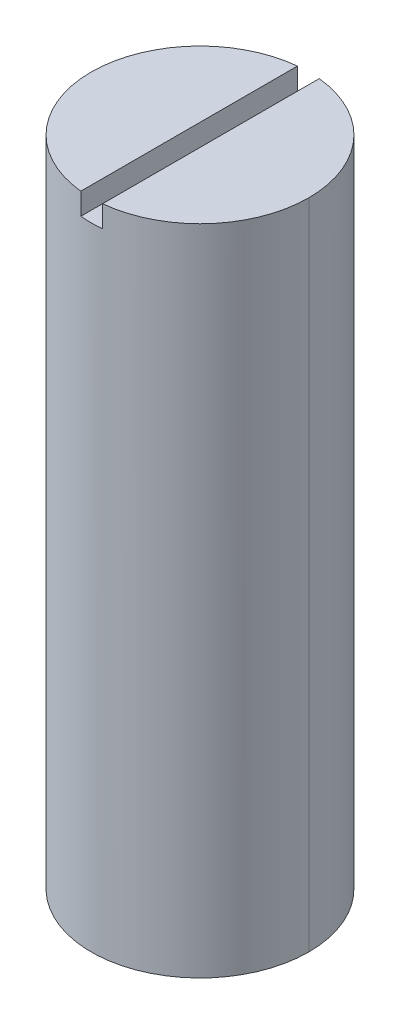
ISO-10303-21;
HEADER;
FILE_DESCRIPTION(('STEP AP214'),'2;1');
FILE_NAME('part.step','',(''),(''),'','','');
FILE_SCHEMA(('AUTOMOTIVE_DESIGN { 1 0 10303 214 1 1 1 1 }'));
ENDSEC;
DATA;
#1=APPLICATION_CONTEXT('core data for automotive mechanical design processes');
#2=APPLICATION_PROTOCOL_DEFINITION('international standard','automotive_design',2000,#1);
#3=PRODUCT_CONTEXT('',#1,'mechanical');
#4=PRODUCT('Part','Part','',(#3));
#5=PRODUCT_RELATED_PRODUCT_CATEGORY('part','',(#4));
#6=PRODUCT_DEFINITION_FORMATION('','',#4);
#7=PRODUCT_DEFINITION_CONTEXT('part definition',#1,'design');
#8=PRODUCT_DEFINITION('design','',#6,#7);
#9=PRODUCT_DEFINITION_SHAPE('','',#8);
#10=(LENGTH_UNIT() NAMED_UNIT(*) SI_UNIT(.MILLI.,.METRE.));
#11=(NAMED_UNIT(*) PLANE_ANGLE_UNIT() SI_UNIT($,.RADIAN.));
#12=(NAMED_UNIT(*) SI_UNIT($,.STERADIAN.) SOLID_ANGLE_UNIT());
#13=UNCERTAINTY_MEASURE_WITH_UNIT(LENGTH_MEASURE(1.E-05),#10,'distance_accuracy_value','');
#14=(GEOMETRIC_REPRESENTATION_CONTEXT(3) GLOBAL_UNCERTAINTY_ASSIGNED_CONTEXT((#13)) GLOBAL_UNIT_ASSIGNED_CONTEXT((#10,
#11,#12)) REPRESENTATION_CONTEXT('',''));
#15=CARTESIAN_POINT('',(0.,0.,0.));
#16=DIRECTION('',(0.,0.,1.));
#17=DIRECTION('',(1.,0.,0.));
#18=AXIS2_PLACEMENT_3D('',#15,#16,#17);
#19=CARTESIAN_POINT('',(-2.1569882664672,34.111718732022,34.1196531671633));
#20=DIRECTION('',(1.,0.,0.));
#21=DIRECTION('',(0.,1.,0.));
#22=AXIS2_PLACEMENT_3D('',#19,#20,#21);
#23=PLANE('',#22);
#24=DIRECTION('',(0.,0.,-1.));
#25=VECTOR('',#24,1.);
#26=CARTESIAN_POINT('',(-2.1569882664672,34.611718732022,36.8596605012302));
#27=LINE('',#26,#25);
#28=CARTESIAN_POINT('',(-2.1569882664672,34.611718732022,39.3471290939967));
#29=VERTEX_POINT('',#28);
#30=CARTESIAN_POINT('',(-2.1569882664672,34.611718732022,34.3721919084636));
#31=VERTEX_POINT('',#30);
#32=EDGE_CURVE('E37',#29,#31,#27,.T.);
#33=ORIENTED_EDGE('',*,*,#32,.T.);
#34=DIRECTION('',(0.,1.,0.));
#35=VECTOR('',#34,1.);
#36=CARTESIAN_POINT('',(-2.1569882664672,34.611718732022,34.3721919084636));
#37=LINE('',#36,#35);
#38=CARTESIAN_POINT('',(-2.1569882664672,34.111718732022,34.3721919084636));
#39=VERTEX_POINT('',#38);
#40=EDGE_CURVE('E147',#39,#31,#37,.T.);
#41=ORIENTED_EDGE('',*,*,#40,.F.);
#42=DIRECTION('',(0.,0.,-1.));
#43=VECTOR('',#42,1.);
#44=CARTESIAN_POINT('',(-2.1569882664672,34.111718732022,34.1196531671633));
#45=LINE('',#44,#43);
#46=CARTESIAN_POINT('',(-2.1569882664672,34.111718732022,39.3471290939967));
#47=VERTEX_POINT('',#46);
#48=EDGE_CURVE('E26',#47,#39,#45,.T.);
#49=ORIENTED_EDGE('',*,*,#48,.F.);
#50=DIRECTION('',(0.,-1.,0.));
#51=VECTOR('',#50,1.);
#52=CARTESIAN_POINT('',(-2.1569882664672,34.611718732022,39.3471290939967));
#53=LINE('',#52,#51);
#54=EDGE_CURVE('E120',#29,#47,#53,.T.);
#55=ORIENTED_EDGE('',*,*,#54,.F.);
#56=EDGE_LOOP('',(#33,#41,#49,#55));
#57=FACE_BOUND('',#56,.T.);
#58=ADVANCED_FACE('F17',(#57),#23,.F.);
#59=CARTESIAN_POINT('',(-2.6569882664672,34.111718732022,34.1196531671633));
#60=DIRECTION('',(-1.,0.,0.));
#61=DIRECTION('',(0.,1.,0.));
#62=AXIS2_PLACEMENT_3D('',#59,#60,#61);
#63=PLANE('',#62);
#64=DIRECTION('',(0.,0.,1.));
#65=VECTOR('',#64,1.);
#66=CARTESIAN_POINT('',(-2.6569882664672,34.611718732022,36.8596605012302));
#67=LINE('',#66,#65);
#68=CARTESIAN_POINT('',(-2.6569882664672,34.611718732022,34.3721919084636));
#69=VERTEX_POINT('',#68);
#70=CARTESIAN_POINT('',(-2.6569882664672,34.611718732022,39.3471290939967));
#71=VERTEX_POINT('',#70);
#72=EDGE_CURVE('E93',#69,#71,#67,.T.);
#73=ORIENTED_EDGE('',*,*,#72,.T.);
#74=DIRECTION('',(0.,1.,0.));
#75=VECTOR('',#74,1.);
#76=CARTESIAN_POINT('',(-2.6569882664672,34.611718732022,39.3471290939967));
#77=LINE('',#76,#75);
#78=CARTESIAN_POINT('',(-2.6569882664672,34.111718732022,39.3471290939967));
#79=VERTEX_POINT('',#78);
#80=EDGE_CURVE('E114',#79,#71,#77,.T.);
#81=ORIENTED_EDGE('',*,*,#80,.F.);
#82=DIRECTION('',(0.,0.,1.));
#83=VECTOR('',#82,1.);
#84=CARTESIAN_POINT('',(-2.6569882664672,34.111718732022,34.1196531671633));
#85=LINE('',#84,#83);
#86=CARTESIAN_POINT('',(-2.6569882664672,34.111718732022,34.3721919084636));
#87=VERTEX_POINT('',#86);
#88=EDGE_CURVE('E11',#87,#79,#85,.T.);
#89=ORIENTED_EDGE('',*,*,#88,.F.);
#90=DIRECTION('',(0.,-1.,0.));
#91=VECTOR('',#90,1.);
#92=CARTESIAN_POINT('',(-2.6569882664672,34.611718732022,34.3721919084636));
#93=LINE('',#92,#91);
#94=EDGE_CURVE('E97',#69,#87,#93,.T.);
#95=ORIENTED_EDGE('',*,*,#94,.F.);
#96=EDGE_LOOP('',(#73,#81,#89,#95));
#97=FACE_BOUND('',#96,.T.);
#98=ADVANCED_FACE('F19',(#97),#63,.F.);
#99=CARTESIAN_POINT('',(-2.40698826646719,34.111718732022,36.8596605012302));
#100=DIRECTION('',(0.,-1.,0.));
#101=DIRECTION('',(0.,0.,-1.));
#102=AXIS2_PLACEMENT_3D('',#99,#100,#101);
#103=PLANE('',#102);
#104=ORIENTED_EDGE('',*,*,#48,.T.);
#105=CARTESIAN_POINT('',(-2.40698826646719,34.111718732022,36.8596605012302));
#106=DIRECTION('',(0.,-1.,0.));
#107=DIRECTION('',(1.,0.,0.));
#108=AXIS2_PLACEMENT_3D('',#105,#106,#107);
#109=CIRCLE('',#108,2.5);
#110=EDGE_CURVE('E141',#87,#39,#109,.T.);
#111=ORIENTED_EDGE('',*,*,#110,.F.);
#112=ORIENTED_EDGE('',*,*,#88,.T.);
#113=CARTESIAN_POINT('',(-2.40698826646719,34.111718732022,36.8596605012302));
#114=DIRECTION('',(0.,-1.,0.));
#115=DIRECTION('',(1.,0.,0.));
#116=AXIS2_PLACEMENT_3D('',#113,#114,#115);
#117=CIRCLE('',#116,2.5);
#118=EDGE_CURVE('E122',#47,#79,#117,.T.);
#119=ORIENTED_EDGE('',*,*,#118,.F.);
#120=EDGE_LOOP('',(#104,#111,#112,#119));
#121=FACE_BOUND('',#120,.T.);
#122=ADVANCED_FACE('F228',(#121),#103,.F.);
#123=CARTESIAN_POINT('',(-2.40698826646716,19.611718732022,36.8596605012302));
#124=DIRECTION('',(0.,1.,0.));
#125=DIRECTION('',(1.,0.,0.));
#126=AXIS2_PLACEMENT_3D('',#123,#124,#125);
#127=PLANE('',#126);
#128=CARTESIAN_POINT('',(-2.40698826646716,19.611718732022,36.8596605012302));
#129=DIRECTION('',(0.,1.,0.));
#130=DIRECTION('',(-1.,0.,0.));
#131=AXIS2_PLACEMENT_3D('',#128,#129,#130);
#132=CIRCLE('',#131,2.5);
#133=CARTESIAN_POINT('',(0.093011733532833,19.611718732022,36.8596605012302));
#134=VERTEX_POINT('',#133);
#135=CARTESIAN_POINT('',(-4.90698826646717,19.611718732022,36.8596605012302));
#136=VERTEX_POINT('',#135);
#137=EDGE_CURVE('E103',#134,#136,#132,.T.);
#138=ORIENTED_EDGE('',*,*,#137,.F.);
#139=CARTESIAN_POINT('',(-2.40698826646716,19.611718732022,36.8596605012302));
#140=DIRECTION('',(0.,1.,0.));
#141=DIRECTION('',(-1.,0.,0.));
#142=AXIS2_PLACEMENT_3D('',#139,#140,#141);
#143=CIRCLE('',#142,2.5);
#144=EDGE_CURVE('E108',#136,#134,#143,.T.);
#145=ORIENTED_EDGE('',*,*,#144,.F.);
#146=EDGE_LOOP('',(#138,#145));
#147=FACE_BOUND('',#146,.T.);
#148=ADVANCED_FACE('F215',(#147),#127,.F.);
#149=CARTESIAN_POINT('',(-2.40698826646719,34.611718732022,36.8596605012302));
#150=DIRECTION('',(0.,1.,0.));
#151=DIRECTION('',(1.,0.,0.));
#152=AXIS2_PLACEMENT_3D('',#149,#150,#151);
#153=PLANE('',#152);
#154=ORIENTED_EDGE('',*,*,#32,.F.);
#155=CARTESIAN_POINT('',(-2.40698826646719,34.611718732022,36.8596605012302));
#156=DIRECTION('',(0.,1.,0.));
#157=DIRECTION('',(-1.,0.,0.));
#158=AXIS2_PLACEMENT_3D('',#155,#156,#157);
#159=CIRCLE('',#158,2.5);
#160=CARTESIAN_POINT('',(0.0930117335328048,34.611718732022,36.8596605012302));
#161=VERTEX_POINT('',#160);
#162=EDGE_CURVE('E123',#29,#161,#159,.T.);
#163=ORIENTED_EDGE('',*,*,#162,.T.);
#164=CARTESIAN_POINT('',(-2.40698826646719,34.611718732022,36.8596605012302));
#165=DIRECTION('',(0.,1.,0.));
#166=DIRECTION('',(-1.,0.,0.));
#167=AXIS2_PLACEMENT_3D('',#164,#165,#166);
#168=CIRCLE('',#167,2.5);
#169=EDGE_CURVE('E151',#161,#31,#168,.T.);
#170=ORIENTED_EDGE('',*,*,#169,.T.);
#171=EDGE_LOOP('',(#154,#163,#170));
#172=FACE_BOUND('',#171,.T.);
#173=ADVANCED_FACE('F203',(#172),#153,.T.);
#174=CARTESIAN_POINT('',(-2.40698826646719,34.611718732022,36.8596605012302));
#175=DIRECTION('',(0.,-1.,0.));
#176=DIRECTION('',(1.,0.,0.));
#177=AXIS2_PLACEMENT_3D('',#174,#175,#176);
#178=CYLINDRICAL_SURFACE('',#177,2.5);
#179=DIRECTION('',(0.,-1.,0.));
#180=VECTOR('',#179,1.);
#181=CARTESIAN_POINT('',(-4.9069882664672,34.611718732022,36.8596605012302));
#182=LINE('',#181,#180);
#183=CARTESIAN_POINT('',(-4.9069882664672,34.611718732022,36.8596605012302));
#184=VERTEX_POINT('',#183);
#185=EDGE_CURVE('E100',#184,#136,#182,.T.);
#186=ORIENTED_EDGE('',*,*,#185,.F.);
#187=CARTESIAN_POINT('',(-2.40698826646719,34.611718732022,36.8596605012302));
#188=DIRECTION('',(0.,1.,0.));
#189=DIRECTION('',(-1.,0.,0.));
#190=AXIS2_PLACEMENT_3D('',#187,#188,#189);
#191=CIRCLE('',#190,2.5);
#192=EDGE_CURVE('E88',#69,#184,#191,.T.);
#193=ORIENTED_EDGE('',*,*,#192,.F.);
#194=ORIENTED_EDGE('',*,*,#94,.T.);
#195=ORIENTED_EDGE('',*,*,#110,.T.);
#196=ORIENTED_EDGE('',*,*,#40,.T.);
#197=ORIENTED_EDGE('',*,*,#169,.F.);
#198=DIRECTION('',(0.,-1.,0.));
#199=VECTOR('',#198,1.);
#200=CARTESIAN_POINT('',(0.0930117335328048,34.611718732022,36.8596605012302));
#201=LINE('',#200,#199);
#202=EDGE_CURVE('E129',#161,#134,#201,.T.);
#203=ORIENTED_EDGE('',*,*,#202,.T.);
#204=ORIENTED_EDGE('',*,*,#137,.T.);
#205=EDGE_LOOP('',(#186,#193,#194,#195,#196,#197,#203,#204));
#206=FACE_BOUND('',#205,.T.);
#207=ADVANCED_FACE('F101',(#206),#178,.T.);
#208=CARTESIAN_POINT('',(-2.40698826646719,34.611718732022,36.8596605012302));
#209=DIRECTION('',(0.,1.,0.));
#210=DIRECTION('',(1.,0.,0.));
#211=AXIS2_PLACEMENT_3D('',#208,#209,#210);
#212=PLANE('',#211);
#213=ORIENTED_EDGE('',*,*,#72,.F.);
#214=ORIENTED_EDGE('',*,*,#192,.T.);
#215=CARTESIAN_POINT('',(-2.40698826646719,34.611718732022,36.8596605012302));
#216=DIRECTION('',(0.,1.,0.));
#217=DIRECTION('',(-1.,0.,0.));
#218=AXIS2_PLACEMENT_3D('',#215,#216,#217);
#219=CIRCLE('',#218,2.5);
#220=EDGE_CURVE('E92',#184,#71,#219,.T.);
#221=ORIENTED_EDGE('',*,*,#220,.T.);
#222=EDGE_LOOP('',(#213,#214,#221));
#223=FACE_BOUND('',#222,.T.);
#224=ADVANCED_FACE('F90',(#223),#212,.T.);
#225=CARTESIAN_POINT('',(-2.40698826646719,34.611718732022,36.8596605012302));
#226=DIRECTION('',(0.,-1.,0.));
#227=DIRECTION('',(1.,0.,0.));
#228=AXIS2_PLACEMENT_3D('',#225,#226,#227);
#229=CYLINDRICAL_SURFACE('',#228,2.5);
#230=ORIENTED_EDGE('',*,*,#220,.F.);
#231=ORIENTED_EDGE('',*,*,#185,.T.);
#232=ORIENTED_EDGE('',*,*,#144,.T.);
#233=ORIENTED_EDGE('',*,*,#202,.F.);
#234=ORIENTED_EDGE('',*,*,#162,.F.);
#235=ORIENTED_EDGE('',*,*,#54,.T.);
#236=ORIENTED_EDGE('',*,*,#118,.T.);
#237=ORIENTED_EDGE('',*,*,#80,.T.);
#238=EDGE_LOOP('',(#230,#231,#232,#233,#234,#235,#236,#237));
#239=FACE_BOUND('',#238,.T.);
#240=ADVANCED_FACE('F111',(#239),#229,.T.);
#241=CLOSED_SHELL('',(#58,#98,#122,#148,#173,#207,#224,#240));
#242=MANIFOLD_SOLID_BREP('B1',#241);
#243=ADVANCED_BREP_SHAPE_REPRESENTATION('',(#18,#242),#14);
#244=SHAPE_DEFINITION_REPRESENTATION(#9,#243);
ENDSEC;
END-ISO-10303-21;
